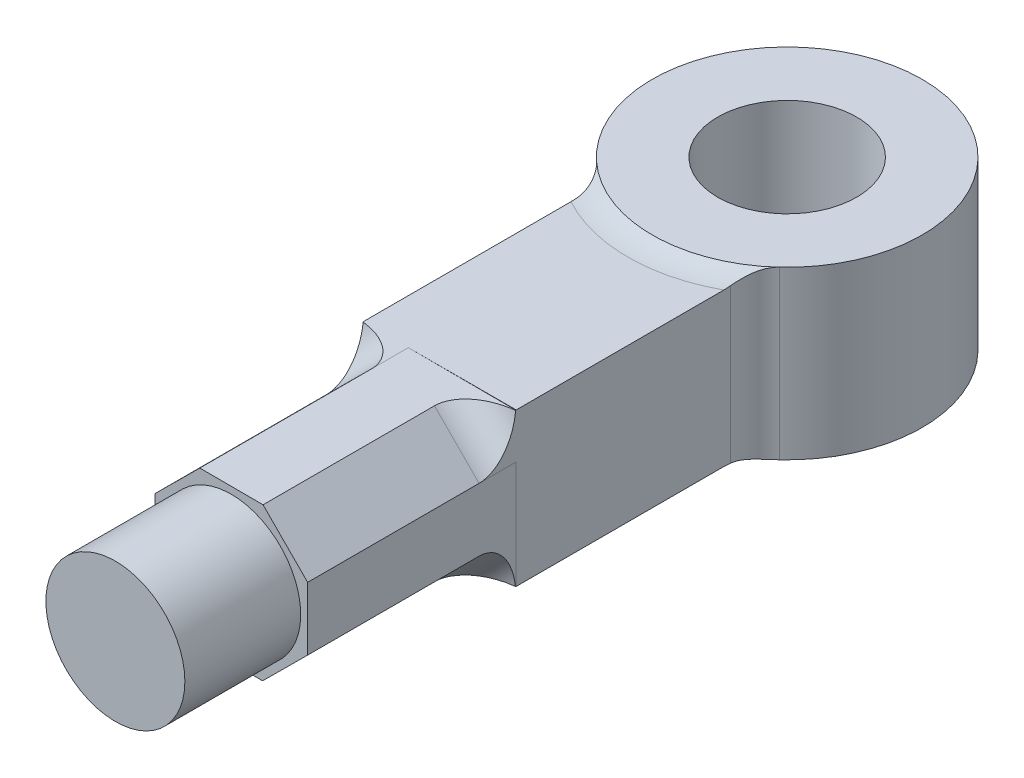
ISO-10303-21;
HEADER;
FILE_DESCRIPTION(('STEP AP214'),'2;1');
FILE_NAME('part.step','',(''),(''),'','','');
FILE_SCHEMA(('AUTOMOTIVE_DESIGN { 1 0 10303 214 1 1 1 1 }'));
ENDSEC;
DATA;
#1=APPLICATION_CONTEXT('core data for automotive mechanical design processes');
#2=APPLICATION_PROTOCOL_DEFINITION('international standard','automotive_design',2000,#1);
#3=PRODUCT_CONTEXT('',#1,'mechanical');
#4=PRODUCT('Part','Part','',(#3));
#5=PRODUCT_RELATED_PRODUCT_CATEGORY('part','',(#4));
#6=PRODUCT_DEFINITION_FORMATION('','',#4);
#7=PRODUCT_DEFINITION_CONTEXT('part definition',#1,'design');
#8=PRODUCT_DEFINITION('design','',#6,#7);
#9=PRODUCT_DEFINITION_SHAPE('','',#8);
#10=(LENGTH_UNIT() NAMED_UNIT(*) SI_UNIT(.MILLI.,.METRE.));
#11=(NAMED_UNIT(*) PLANE_ANGLE_UNIT() SI_UNIT($,.RADIAN.));
#12=(NAMED_UNIT(*) SI_UNIT($,.STERADIAN.) SOLID_ANGLE_UNIT());
#13=UNCERTAINTY_MEASURE_WITH_UNIT(LENGTH_MEASURE(1.E-05),#10,'distance_accuracy_value','');
#14=(GEOMETRIC_REPRESENTATION_CONTEXT(3) GLOBAL_UNCERTAINTY_ASSIGNED_CONTEXT((#13)) GLOBAL_UNIT_ASSIGNED_CONTEXT((#10,
#11,#12)) REPRESENTATION_CONTEXT('',''));
#15=CARTESIAN_POINT('',(0.,0.,0.));
#16=DIRECTION('',(0.,0.,1.));
#17=DIRECTION('',(1.,0.,0.));
#18=AXIS2_PLACEMENT_3D('',#15,#16,#17);
#19=CARTESIAN_POINT('',(0.,0.,75.));
#20=DIRECTION('',(0.,0.,1.));
#21=DIRECTION('',(1.,0.,0.));
#22=AXIS2_PLACEMENT_3D('',#19,#20,#21);
#23=PLANE('',#22);
#24=DIRECTION('',(0.999995344391328,-0.00305142518647974,0.));
#25=VECTOR('',#24,1.);
#26=CARTESIAN_POINT('',(-6.87618139629296,-16.4583423828631,75.));
#27=LINE('',#26,#25);
#28=CARTESIAN_POINT('',(-16.5,-16.4289758836667,75.));
#29=VERTEX_POINT('',#28);
#30=CARTESIAN_POINT('',(6.77561101202491,-16.5,75.));
#31=VERTEX_POINT('',#30);
#32=EDGE_CURVE('E575',#29,#31,#27,.T.);
#33=ORIENTED_EDGE('',*,*,#32,.F.);
#34=DIRECTION('',(0.,-1.,0.));
#35=VECTOR('',#34,1.);
#36=CARTESIAN_POINT('',(-16.5,16.5,75.));
#37=LINE('',#36,#35);
#38=CARTESIAN_POINT('',(-16.5,-16.5,75.));
#39=VERTEX_POINT('',#38);
#40=EDGE_CURVE('E249',#29,#39,#37,.T.);
#41=ORIENTED_EDGE('',*,*,#40,.T.);
#42=DIRECTION('',(1.,0.,0.));
#43=VECTOR('',#42,1.);
#44=CARTESIAN_POINT('',(-16.5,-16.5,75.));
#45=LINE('',#44,#43);
#46=EDGE_CURVE('E255',#39,#31,#45,.T.);
#47=ORIENTED_EDGE('',*,*,#46,.T.);
#48=EDGE_LOOP('',(#33,#41,#47));
#49=FACE_BOUND('',#48,.T.);
#50=ADVANCED_FACE('F43',(#49),#23,.T.);
#51=DIRECTION('',(-0.00305142518647999,-0.999995344391328,0.));
#52=VECTOR('',#51,1.);
#53=CARTESIAN_POINT('',(-16.4583423828631,6.87618139629296,75.));
#54=LINE('',#53,#52);
#55=CARTESIAN_POINT('',(-16.4289758836667,16.5,75.));
#56=VERTEX_POINT('',#55);
#57=CARTESIAN_POINT('',(-16.4999999999998,-6.77561101190644,75.));
#58=VERTEX_POINT('',#57);
#59=EDGE_CURVE('E220',#56,#58,#54,.T.);
#60=ORIENTED_EDGE('',*,*,#59,.F.);
#61=DIRECTION('',(-1.,0.,0.));
#62=VECTOR('',#61,1.);
#63=CARTESIAN_POINT('',(-16.5,16.5,75.));
#64=LINE('',#63,#62);
#65=CARTESIAN_POINT('',(-16.5,16.5,75.));
#66=VERTEX_POINT('',#65);
#67=EDGE_CURVE('E243',#56,#66,#64,.T.);
#68=ORIENTED_EDGE('',*,*,#67,.T.);
#69=EDGE_CURVE('E250',#66,#58,#37,.T.);
#70=ORIENTED_EDGE('',*,*,#69,.T.);
#71=EDGE_LOOP('',(#60,#68,#70));
#72=FACE_BOUND('',#71,.T.);
#73=ADVANCED_FACE('F505',(#72),#23,.T.);
#74=DIRECTION('',(-0.999995344391328,0.00305142518647567,0.));
#75=VECTOR('',#74,1.);
#76=CARTESIAN_POINT('',(6.87618139629296,16.4583423828631,75.));
#77=LINE('',#76,#75);
#78=CARTESIAN_POINT('',(16.5,16.4289758836667,75.));
#79=VERTEX_POINT('',#78);
#80=CARTESIAN_POINT('',(-6.77561101178325,16.4999999999996,75.));
#81=VERTEX_POINT('',#80);
#82=EDGE_CURVE('E474',#79,#81,#77,.T.);
#83=ORIENTED_EDGE('',*,*,#82,.F.);
#84=DIRECTION('',(0.,1.,0.));
#85=VECTOR('',#84,1.);
#86=CARTESIAN_POINT('',(16.5,16.5,75.));
#87=LINE('',#86,#85);
#88=CARTESIAN_POINT('',(16.5,16.5,75.));
#89=VERTEX_POINT('',#88);
#90=EDGE_CURVE('E244',#79,#89,#87,.T.);
#91=ORIENTED_EDGE('',*,*,#90,.T.);
#92=EDGE_CURVE('E245',#89,#81,#64,.T.);
#93=ORIENTED_EDGE('',*,*,#92,.T.);
#94=EDGE_LOOP('',(#83,#91,#93));
#95=FACE_BOUND('',#94,.T.);
#96=ADVANCED_FACE('F512',(#95),#23,.T.);
#97=CARTESIAN_POINT('',(0.,35.539952644041,0.));
#98=DIRECTION('',(0.,1.,0.));
#99=DIRECTION('',(0.,0.,1.));
#100=AXIS2_PLACEMENT_3D('',#97,#98,#99);
#101=CYLINDRICAL_SURFACE('',#100,15.);
#102=CARTESIAN_POINT('',(0.,18.,0.));
#103=DIRECTION('',(0.,1.,0.));
#104=DIRECTION('',(0.,0.,1.));
#105=AXIS2_PLACEMENT_3D('',#102,#103,#104);
#106=CIRCLE('',#105,15.);
#107=CARTESIAN_POINT('',(0.,18.,15.));
#108=VERTEX_POINT('',#107);
#109=EDGE_CURVE('E285',#108,#108,#106,.T.);
#110=ORIENTED_EDGE('',*,*,#109,.T.);
#111=EDGE_LOOP('',(#110));
#112=FACE_BOUND('',#111,.T.);
#113=CARTESIAN_POINT('',(0.,-18.,0.));
#114=DIRECTION('',(0.,1.,0.));
#115=DIRECTION('',(0.,0.,1.));
#116=AXIS2_PLACEMENT_3D('',#113,#114,#115);
#117=CIRCLE('',#116,15.);
#118=CARTESIAN_POINT('',(0.,-18.,15.));
#119=VERTEX_POINT('',#118);
#120=EDGE_CURVE('E289',#119,#119,#117,.T.);
#121=ORIENTED_EDGE('',*,*,#120,.F.);
#122=EDGE_LOOP('',(#121));
#123=FACE_BOUND('',#122,.T.);
#124=ADVANCED_FACE('F526',(#112,#123),#101,.F.);
#125=CARTESIAN_POINT('',(0.,35.539952644041,0.));
#126=DIRECTION('',(0.,1.,0.));
#127=DIRECTION('',(0.,0.,1.));
#128=AXIS2_PLACEMENT_3D('',#125,#126,#127);
#129=CYLINDRICAL_SURFACE('',#128,29.1216151340223);
#130=CARTESIAN_POINT('',(0.,18.,0.));
#131=DIRECTION('',(0.,1.,0.));
#132=DIRECTION('',(0.,0.,1.));
#133=AXIS2_PLACEMENT_3D('',#130,#131,#132);
#134=CIRCLE('',#133,29.1216151340223);
#135=CARTESIAN_POINT('',(19.7262510355933,18.,21.4229663701101));
#136=VERTEX_POINT('',#135);
#137=CARTESIAN_POINT('',(-19.7262510355933,18.,21.4229663701101));
#138=VERTEX_POINT('',#137);
#139=EDGE_CURVE('E281',#136,#138,#134,.T.);
#140=ORIENTED_EDGE('',*,*,#139,.F.);
#141=DIRECTION('',(0.,1.,0.));
#142=VECTOR('',#141,1.);
#143=CARTESIAN_POINT('',(19.7262510355933,35.539952644041,21.4229663701101));
#144=LINE('',#143,#142);
#145=CARTESIAN_POINT('',(19.7262510355933,-18.,21.4229663701101));
#146=VERTEX_POINT('',#145);
#147=EDGE_CURVE('E551',#136,#146,#144,.F.);
#148=ORIENTED_EDGE('',*,*,#147,.T.);
#149=CARTESIAN_POINT('',(0.,-18.,0.));
#150=DIRECTION('',(0.,1.,0.));
#151=DIRECTION('',(0.,0.,1.));
#152=AXIS2_PLACEMENT_3D('',#149,#150,#151);
#153=CIRCLE('',#152,29.1216151340223);
#154=CARTESIAN_POINT('',(-19.7262510355933,-18.,21.4229663701101));
#155=VERTEX_POINT('',#154);
#156=EDGE_CURVE('E276',#146,#155,#153,.T.);
#157=ORIENTED_EDGE('',*,*,#156,.T.);
#158=DIRECTION('',(0.,1.,0.));
#159=VECTOR('',#158,1.);
#160=CARTESIAN_POINT('',(-19.7262510355933,35.539952644041,21.4229663701101));
#161=LINE('',#160,#159);
#162=EDGE_CURVE('E548',#155,#138,#161,.T.);
#163=ORIENTED_EDGE('',*,*,#162,.T.);
#164=EDGE_LOOP('',(#140,#148,#157,#163));
#165=FACE_BOUND('',#164,.T.);
#166=ADVANCED_FACE('F531',(#165),#129,.T.);
#167=CARTESIAN_POINT('',(15.,-18.,0.));
#168=DIRECTION('',(0.,1.,0.));
#169=DIRECTION('',(0.,0.,1.));
#170=AXIS2_PLACEMENT_3D('',#167,#168,#169);
#171=PLANE('',#170);
#172=ORIENTED_EDGE('',*,*,#156,.F.);
#173=EDGE_CURVE('E275',#155,#146,#153,.T.);
#174=ORIENTED_EDGE('',*,*,#173,.F.);
#175=EDGE_LOOP('',(#172,#174));
#176=FACE_BOUND('',#175,.T.);
#177=ORIENTED_EDGE('',*,*,#120,.T.);
#178=EDGE_LOOP('',(#177));
#179=FACE_BOUND('',#178,.T.);
#180=ADVANCED_FACE('F326',(#176,#179),#171,.F.);
#181=CARTESIAN_POINT('',(15.,18.,0.));
#182=DIRECTION('',(0.,-1.,0.));
#183=DIRECTION('',(0.,0.,-1.));
#184=AXIS2_PLACEMENT_3D('',#181,#182,#183);
#185=PLANE('',#184);
#186=ORIENTED_EDGE('',*,*,#109,.F.);
#187=EDGE_LOOP('',(#186));
#188=FACE_BOUND('',#187,.T.);
#189=EDGE_CURVE('E280',#138,#136,#134,.T.);
#190=ORIENTED_EDGE('',*,*,#189,.T.);
#191=ORIENTED_EDGE('',*,*,#139,.T.);
#192=EDGE_LOOP('',(#190,#191));
#193=FACE_BOUND('',#192,.T.);
#194=ADVANCED_FACE('F516',(#188,#193),#185,.F.);
#195=DIRECTION('',(0.00305142518647948,0.999995344391328,0.));
#196=VECTOR('',#195,1.);
#197=CARTESIAN_POINT('',(16.4583423828631,-6.87618139629296,75.));
#198=LINE('',#197,#196);
#199=CARTESIAN_POINT('',(16.4289758836667,-16.5,75.));
#200=VERTEX_POINT('',#199);
#201=CARTESIAN_POINT('',(16.4999999999997,6.77561101180887,75.));
#202=VERTEX_POINT('',#201);
#203=EDGE_CURVE('E430',#200,#202,#198,.T.);
#204=ORIENTED_EDGE('',*,*,#203,.F.);
#205=CARTESIAN_POINT('',(16.5,-16.5,75.));
#206=VERTEX_POINT('',#205);
#207=EDGE_CURVE('E254',#200,#206,#45,.T.);
#208=ORIENTED_EDGE('',*,*,#207,.T.);
#209=EDGE_CURVE('E239',#206,#202,#87,.T.);
#210=ORIENTED_EDGE('',*,*,#209,.T.);
#211=EDGE_LOOP('',(#204,#208,#210));
#212=FACE_BOUND('',#211,.T.);
#213=ADVANCED_FACE('F508',(#212),#23,.T.);
#214=CARTESIAN_POINT('',(-16.5,-16.5,75.));
#215=DIRECTION('',(0.,1.,0.));
#216=DIRECTION('',(0.,0.,1.));
#217=AXIS2_PLACEMENT_3D('',#214,#215,#216);
#218=PLANE('',#217);
#219=DIRECTION('',(0.,0.,-1.));
#220=VECTOR('',#219,1.);
#221=CARTESIAN_POINT('',(-16.5,-16.5,75.));
#222=LINE('',#221,#220);
#223=CARTESIAN_POINT('',(-16.5,-16.5,30.1725657144037));
#224=VERTEX_POINT('',#223);
#225=EDGE_CURVE('E263',#39,#224,#222,.T.);
#226=ORIENTED_EDGE('',*,*,#225,.T.);
#227=CARTESIAN_POINT('',(0.,-16.5,0.));
#228=DIRECTION('',(0.,1.,0.));
#229=DIRECTION('',(0.,0.,1.));
#230=AXIS2_PLACEMENT_3D('',#227,#228,#229);
#231=CIRCLE('',#230,34.3894420104487);
#232=CARTESIAN_POINT('',(16.5,-16.5,30.1725657144037));
#233=VERTEX_POINT('',#232);
#234=EDGE_CURVE('E545',#224,#233,#231,.T.);
#235=ORIENTED_EDGE('',*,*,#234,.T.);
#236=DIRECTION('',(0.,0.,-1.));
#237=VECTOR('',#236,1.);
#238=CARTESIAN_POINT('',(16.5,-16.5,75.));
#239=LINE('',#238,#237);
#240=EDGE_CURVE('E259',#206,#233,#239,.T.);
#241=ORIENTED_EDGE('',*,*,#240,.F.);
#242=ORIENTED_EDGE('',*,*,#207,.F.);
#243=DIRECTION('',(0.,0.,1.));
#244=VECTOR('',#243,1.);
#245=CARTESIAN_POINT('',(16.4289758836667,-16.5,75.));
#246=LINE('',#245,#244);
#247=CARTESIAN_POINT('',(16.4289758836667,-16.5,75.0897400936926));
#248=VERTEX_POINT('',#247);
#249=EDGE_CURVE('E459',#200,#248,#246,.T.);
#250=ORIENTED_EDGE('',*,*,#249,.T.);
#251=CARTESIAN_POINT('',(18.124001108038,-16.5,83.));
#252=DIRECTION('',(0.,1.,0.));
#253=DIRECTION('',(1.,0.,0.));
#254=AXIS2_PLACEMENT_3D('',#251,#252,#253);
#255=ELLIPSE('',#254,11.3483900960131,8.);
#256=CARTESIAN_POINT('',(6.77561101202492,-16.5,83.));
#257=VERTEX_POINT('',#256);
#258=EDGE_CURVE('E437',#248,#257,#255,.T.);
#259=ORIENTED_EDGE('',*,*,#258,.T.);
#260=DIRECTION('',(0.,0.,1.));
#261=VECTOR('',#260,1.);
#262=CARTESIAN_POINT('',(6.77561101202492,-16.5,120.));
#263=LINE('',#262,#261);
#264=EDGE_CURVE('E225',#31,#257,#263,.T.);
#265=ORIENTED_EDGE('',*,*,#264,.F.);
#266=ORIENTED_EDGE('',*,*,#46,.F.);
#267=EDGE_LOOP('',(#226,#235,#241,#242,#250,#259,#265,#266));
#268=FACE_BOUND('',#267,.T.);
#269=ADVANCED_FACE('F495',(#268),#218,.F.);
#270=CARTESIAN_POINT('',(-16.5,16.5,75.));
#271=DIRECTION('',(0.,-1.,0.));
#272=DIRECTION('',(0.,0.,-1.));
#273=AXIS2_PLACEMENT_3D('',#270,#271,#272);
#274=PLANE('',#273);
#275=DIRECTION('',(0.,0.,-1.));
#276=VECTOR('',#275,1.);
#277=CARTESIAN_POINT('',(16.5,16.5,75.));
#278=LINE('',#277,#276);
#279=CARTESIAN_POINT('',(16.5,16.5,30.1725657144037));
#280=VERTEX_POINT('',#279);
#281=EDGE_CURVE('E271',#89,#280,#278,.T.);
#282=ORIENTED_EDGE('',*,*,#281,.T.);
#283=CARTESIAN_POINT('',(0.,16.5,0.));
#284=DIRECTION('',(0.,-1.,0.));
#285=DIRECTION('',(0.,0.,-1.));
#286=AXIS2_PLACEMENT_3D('',#283,#284,#285);
#287=CIRCLE('',#286,34.3894420104486);
#288=CARTESIAN_POINT('',(-16.5,16.5,30.1725657144037));
#289=VERTEX_POINT('',#288);
#290=EDGE_CURVE('E293',#280,#289,#287,.T.);
#291=ORIENTED_EDGE('',*,*,#290,.T.);
#292=DIRECTION('',(0.,0.,-1.));
#293=VECTOR('',#292,1.);
#294=CARTESIAN_POINT('',(-16.5,16.5,75.));
#295=LINE('',#294,#293);
#296=EDGE_CURVE('E267',#66,#289,#295,.T.);
#297=ORIENTED_EDGE('',*,*,#296,.F.);
#298=ORIENTED_EDGE('',*,*,#67,.F.);
#299=DIRECTION('',(0.,0.,1.));
#300=VECTOR('',#299,1.);
#301=CARTESIAN_POINT('',(-16.4289758836667,16.5,75.));
#302=LINE('',#301,#300);
#303=CARTESIAN_POINT('',(-16.4289758836667,16.5,75.0897400936926));
#304=VERTEX_POINT('',#303);
#305=EDGE_CURVE('E432',#56,#304,#302,.T.);
#306=ORIENTED_EDGE('',*,*,#305,.T.);
#307=CARTESIAN_POINT('',(-18.124001108038,16.5,83.));
#308=DIRECTION('',(0.,-1.,0.));
#309=DIRECTION('',(-1.,0.,0.));
#310=AXIS2_PLACEMENT_3D('',#307,#308,#309);
#311=ELLIPSE('',#310,11.3483900960131,8.);
#312=CARTESIAN_POINT('',(-6.77561101203458,16.5,82.9999925951792));
#313=VERTEX_POINT('',#312);
#314=EDGE_CURVE('E446',#304,#313,#311,.T.);
#315=ORIENTED_EDGE('',*,*,#314,.T.);
#316=DIRECTION('',(0.,0.,1.));
#317=VECTOR('',#316,1.);
#318=CARTESIAN_POINT('',(-6.77561101204424,16.5,120.));
#319=LINE('',#318,#317);
#320=EDGE_CURVE('E53',#81,#313,#319,.T.);
#321=ORIENTED_EDGE('',*,*,#320,.F.);
#322=ORIENTED_EDGE('',*,*,#92,.F.);
#323=EDGE_LOOP('',(#282,#291,#297,#298,#306,#315,#321,#322));
#324=FACE_BOUND('',#323,.T.);
#325=ADVANCED_FACE('F522',(#324),#274,.F.);
#326=CARTESIAN_POINT('',(-16.5,16.5,75.));
#327=DIRECTION('',(1.,0.,0.));
#328=DIRECTION('',(0.,1.,0.));
#329=AXIS2_PLACEMENT_3D('',#326,#327,#328);
#330=PLANE('',#329);
#331=CARTESIAN_POINT('',(-16.5,16.5,30.1725657144037));
#332=CARTESIAN_POINT('',(-16.5,16.4999826263791,29.7410259284523));
#333=CARTESIAN_POINT('',(-16.5,16.5215004059836,29.3095895094575));
#334=CARTESIAN_POINT('',(-16.5,16.6061863159555,28.4506569435438));
#335=CARTESIAN_POINT('',(-16.5,16.6693687648358,28.0231622024551));
#336=CARTESIAN_POINT('',(-16.5,16.8341914286109,27.1851512942685));
#337=CARTESIAN_POINT('',(-16.5,16.934985579774,26.7744673819231));
#338=CARTESIAN_POINT('',(-16.5,17.173727041169,25.9642993223079));
#339=CARTESIAN_POINT('',(-16.5,17.3116477148838,25.5648073713306));
#340=CARTESIAN_POINT('',(-16.5,17.5467776793455,24.9730221151067));
#341=CARTESIAN_POINT('',(-16.5,17.6307002566657,24.7753549087669));
#342=CARTESIAN_POINT('',(-16.5,17.8081919854659,24.3830844860247));
#343=CARTESIAN_POINT('',(-16.5,17.9018118446751,24.1885042153486));
#344=CARTESIAN_POINT('',(-16.5,18.,23.9962177856035));
#345=B_SPLINE_CURVE_WITH_KNOTS('',3,(#331,#332,#333,#334,#335,#336,#337,#338,#339,#340,#341,
#342,#343,#344),.UNSPECIFIED.,.F.,.F.,(4,2,2,2,2,2,4),(0.,1.29394428637386,2.58833348256147,
3.85520730098164,5.12117460897788,5.7652053200681,6.4127922472087),.UNSPECIFIED.);
#346=CARTESIAN_POINT('',(-16.5,16.5741647271571,28.7793462520357));
#347=VERTEX_POINT('',#346);
#348=EDGE_CURVE('E297',#289,#347,#345,.T.);
#349=ORIENTED_EDGE('',*,*,#348,.T.);
#350=DIRECTION('',(0.,-1.,0.));
#351=VECTOR('',#350,1.);
#352=CARTESIAN_POINT('',(-16.5,-16.5,28.7793462520357));
#353=LINE('',#352,#351);
#354=CARTESIAN_POINT('',(-16.5,-16.5741647271571,28.7793462520357));
#355=VERTEX_POINT('',#354);
#356=EDGE_CURVE('E557',#347,#355,#353,.T.);
#357=ORIENTED_EDGE('',*,*,#356,.T.);
#358=CARTESIAN_POINT('',(-16.5,-16.5741647271571,28.7793462520357));
#359=CARTESIAN_POINT('',(-16.5,-16.5618706565201,28.8950549775934));
#360=CARTESIAN_POINT('',(-16.5,-16.5510869500951,29.0109247354759));
#361=CARTESIAN_POINT('',(-16.5,-16.5325739567857,29.2428263333676));
#362=CARTESIAN_POINT('',(-16.5,-16.5248425384399,29.358858003287));
#363=CARTESIAN_POINT('',(-16.5,-16.512450471289,29.5910867842669));
#364=CARTESIAN_POINT('',(-16.5,-16.5077898550496,29.7072838970687));
#365=CARTESIAN_POINT('',(-16.5,-16.5015634594469,29.9398423120486));
#366=CARTESIAN_POINT('',(-16.5,-16.4999998489196,30.0562036722227));
#367=CARTESIAN_POINT('',(-16.5,-16.5,30.1725657144037));
#368=B_SPLINE_CURVE_WITH_KNOTS('',3,(#358,#359,#360,#361,#362,#363,#364,#365,#366,#367),
.UNSPECIFIED.,.F.,.F.,(4,2,2,2,4),(0.,0.349070935310408,0.697897675807058,1.04672811552504,
1.39580275525958),.UNSPECIFIED.);
#369=EDGE_CURVE('E345',#355,#224,#368,.T.);
#370=ORIENTED_EDGE('',*,*,#369,.T.);
#371=ORIENTED_EDGE('',*,*,#225,.F.);
#372=ORIENTED_EDGE('',*,*,#40,.F.);
#373=DIRECTION('',(0.,0.,1.));
#374=VECTOR('',#373,1.);
#375=CARTESIAN_POINT('',(-16.5,-16.4289758836667,75.));
#376=LINE('',#375,#374);
#377=CARTESIAN_POINT('',(-16.5,-16.4289758836667,75.0897400936926));
#378=VERTEX_POINT('',#377);
#379=EDGE_CURVE('E449',#29,#378,#376,.T.);
#380=ORIENTED_EDGE('',*,*,#379,.T.);
#381=CARTESIAN_POINT('',(-16.5,-18.124001108038,83.));
#382=DIRECTION('',(1.,0.,0.));
#383=DIRECTION('',(0.,-1.,0.));
#384=AXIS2_PLACEMENT_3D('',#381,#382,#383);
#385=ELLIPSE('',#384,11.3483900960131,8.);
#386=CARTESIAN_POINT('',(-16.5,-6.77561101202491,83.));
#387=VERTEX_POINT('',#386);
#388=EDGE_CURVE('E483',#378,#387,#385,.T.);
#389=ORIENTED_EDGE('',*,*,#388,.T.);
#390=DIRECTION('',(0.,0.,1.));
#391=VECTOR('',#390,1.);
#392=CARTESIAN_POINT('',(-16.5,-6.77561101202331,120.));
#393=LINE('',#392,#391);
#394=EDGE_CURVE('E455',#58,#387,#393,.T.);
#395=ORIENTED_EDGE('',*,*,#394,.F.);
#396=ORIENTED_EDGE('',*,*,#69,.F.);
#397=ORIENTED_EDGE('',*,*,#296,.T.);
#398=EDGE_LOOP('',(#349,#357,#370,#371,#372,#380,#389,#395,#396,#397));
#399=FACE_BOUND('',#398,.T.);
#400=ADVANCED_FACE('F314',(#399),#330,.F.);
#401=CARTESIAN_POINT('',(16.5,16.5,75.));
#402=DIRECTION('',(-1.,0.,0.));
#403=DIRECTION('',(0.,-1.,0.));
#404=AXIS2_PLACEMENT_3D('',#401,#402,#403);
#405=PLANE('',#404);
#406=CARTESIAN_POINT('',(16.5,-16.5,30.1725657144037));
#407=CARTESIAN_POINT('',(16.5,-16.4999998489196,30.0562036722227));
#408=CARTESIAN_POINT('',(16.5,-16.5015634594469,29.9398423120486));
#409=CARTESIAN_POINT('',(16.5,-16.5077898550496,29.7072838970687));
#410=CARTESIAN_POINT('',(16.5,-16.512450471289,29.5910867842669));
#411=CARTESIAN_POINT('',(16.5,-16.5248425384399,29.358858003287));
#412=CARTESIAN_POINT('',(16.5,-16.5325739567857,29.2428263333676));
#413=CARTESIAN_POINT('',(16.5,-16.5510869500951,29.0109247354759));
#414=CARTESIAN_POINT('',(16.5,-16.5618706565201,28.8950549775934));
#415=CARTESIAN_POINT('',(16.5,-16.5741647271571,28.7793462520357));
#416=B_SPLINE_CURVE_WITH_KNOTS('',3,(#406,#407,#408,#409,#410,#411,#412,#413,#414,#415),
.UNSPECIFIED.,.F.,.F.,(4,2,2,2,4),(0.,0.349074639734524,0.697905079452511,1.04673181994916,
1.39580275525956),.UNSPECIFIED.);
#417=CARTESIAN_POINT('',(16.5,-16.5741647271571,28.7793462520357));
#418=VERTEX_POINT('',#417);
#419=EDGE_CURVE('E560',#233,#418,#416,.T.);
#420=ORIENTED_EDGE('',*,*,#419,.T.);
#421=DIRECTION('',(0.,-1.,0.));
#422=VECTOR('',#421,1.);
#423=CARTESIAN_POINT('',(16.5,18.,28.7793462520357));
#424=LINE('',#423,#422);
#425=CARTESIAN_POINT('',(16.5,16.5741647271549,28.7793462520563));
#426=VERTEX_POINT('',#425);
#427=EDGE_CURVE('E554',#418,#426,#424,.F.);
#428=ORIENTED_EDGE('',*,*,#427,.T.);
#429=CARTESIAN_POINT('',(16.5,18.,23.9962177856036));
#430=CARTESIAN_POINT('',(16.5,17.804042432493,24.3800248534783));
#431=CARTESIAN_POINT('',(16.5,17.6261976982969,24.7730713581624));
#432=CARTESIAN_POINT('',(16.5,17.3078433567267,25.5744456273851));
#433=CARTESIAN_POINT('',(16.5,17.1673698761392,25.9827877464126));
#434=CARTESIAN_POINT('',(16.5,16.9278909540535,26.8017704478447));
#435=CARTESIAN_POINT('',(16.5,16.82804770094,27.2121665406336));
#436=CARTESIAN_POINT('',(16.5,16.6669096324146,28.0401616842526));
#437=CARTESIAN_POINT('',(16.5,16.6055795855285,28.457753791816));
#438=CARTESIAN_POINT('',(16.5,16.5429255982997,29.0918051959721));
#439=CARTESIAN_POINT('',(16.5,16.5269240173645,29.3068998934332));
#440=CARTESIAN_POINT('',(16.5,16.5054320817772,29.7388362210268));
#441=CARTESIAN_POINT('',(16.5,16.5000018827512,29.9556808384521));
#442=CARTESIAN_POINT('',(16.5,16.5,30.1725657144037));
#443=B_SPLINE_CURVE_WITH_KNOTS('',3,(#429,#430,#431,#432,#433,#434,#435,#436,#437,#438,#439,
#440,#441,#442),.UNSPECIFIED.,.F.,.F.,(4,2,2,2,2,2,4),(0.,1.29233639163793,2.58591758214176,
3.85127794969538,5.11547908622128,5.7623195111448,6.41283009466045),.UNSPECIFIED.);
#444=EDGE_CURVE('E307',#426,#280,#443,.T.);
#445=ORIENTED_EDGE('',*,*,#444,.T.);
#446=ORIENTED_EDGE('',*,*,#281,.F.);
#447=ORIENTED_EDGE('',*,*,#90,.F.);
#448=DIRECTION('',(0.,0.,1.));
#449=VECTOR('',#448,1.);
#450=CARTESIAN_POINT('',(16.5,16.4289758836667,75.));
#451=LINE('',#450,#449);
#452=CARTESIAN_POINT('',(16.5,16.4289758836667,75.0897400936926));
#453=VERTEX_POINT('',#452);
#454=EDGE_CURVE('E422',#79,#453,#451,.T.);
#455=ORIENTED_EDGE('',*,*,#454,.T.);
#456=CARTESIAN_POINT('',(16.5,18.124001108038,83.));
#457=DIRECTION('',(-1.,0.,0.));
#458=DIRECTION('',(0.,1.,0.));
#459=AXIS2_PLACEMENT_3D('',#456,#457,#458);
#460=ELLIPSE('',#459,11.3483900960131,8.);
#461=CARTESIAN_POINT('',(16.5,6.77561101202493,83.));
#462=VERTEX_POINT('',#461);
#463=EDGE_CURVE('E416',#453,#462,#460,.T.);
#464=ORIENTED_EDGE('',*,*,#463,.T.);
#465=DIRECTION('',(0.,0.,1.));
#466=VECTOR('',#465,1.);
#467=CARTESIAN_POINT('',(16.5,6.7756110120256,120.));
#468=LINE('',#467,#466);
#469=EDGE_CURVE('E419',#202,#462,#468,.T.);
#470=ORIENTED_EDGE('',*,*,#469,.F.);
#471=ORIENTED_EDGE('',*,*,#209,.F.);
#472=ORIENTED_EDGE('',*,*,#240,.T.);
#473=EDGE_LOOP('',(#420,#428,#445,#446,#447,#455,#464,#470,#471,#472));
#474=FACE_BOUND('',#473,.T.);
#475=ADVANCED_FACE('F324',(#474),#405,.F.);
#476=CARTESIAN_POINT('',(0.,26.5,0.));
#477=DIRECTION('',(0.,-1.,0.));
#478=DIRECTION('',(0.,0.,-1.));
#479=AXIS2_PLACEMENT_3D('',#476,#477,#478);
#480=TOROIDAL_SURFACE('',#479,34.3894420104486,10.);
#481=ORIENTED_EDGE('',*,*,#444,.F.);
#482=CARTESIAN_POINT('',(16.5,16.5741647271572,28.7793462520357));
#483=CARTESIAN_POINT('',(16.4999991463114,16.5890365597983,28.6393492121577));
#484=CARTESIAN_POINT('',(16.502940170049,16.6059445134704,28.4996007097701));
#485=CARTESIAN_POINT('',(16.5146329749657,16.6434067570666,28.2208692779692));
#486=CARTESIAN_POINT('',(16.5233833717416,16.6639601774025,28.0818861741119));
#487=CARTESIAN_POINT('',(16.558203670365,16.7303905166774,27.6668361709195));
#488=CARTESIAN_POINT('',(16.5928431758895,16.7810884191725,27.3922137317962));
#489=CARTESIAN_POINT('',(16.6844895677429,16.8919228449266,26.8473827251292));
#490=CARTESIAN_POINT('',(16.741601150537,16.9521027459718,26.5772010755633));
#491=CARTESIAN_POINT('',(16.8775637108067,17.0778405945778,26.0435536666951));
#492=CARTESIAN_POINT('',(16.9564226899638,17.1434005154007,25.7800904183993));
#493=CARTESIAN_POINT('',(17.1350933976702,17.2755280432518,25.2617595217434));
#494=CARTESIAN_POINT('',(17.2348290197091,17.3420911966867,25.0068644512937));
#495=CARTESIAN_POINT('',(17.4551918012785,17.4721782289682,24.5054212483028));
#496=CARTESIAN_POINT('',(17.5758200724879,17.5357019458594,24.2588735607534));
#497=CARTESIAN_POINT('',(17.8371847594414,17.6549459893199,23.7762900445388));
#498=CARTESIAN_POINT('',(17.9778209540843,17.7107026205062,23.5402090865518));
#499=CARTESIAN_POINT('',(18.2793391544417,17.81031346987,23.0787707835545));
#500=CARTESIAN_POINT('',(18.4402078185476,17.8541754719412,22.853406505532));
#501=CARTESIAN_POINT('',(18.6946153958707,17.9077735104774,22.5267783810219));
#502=CARTESIAN_POINT('',(18.7807873920245,17.9235202411065,22.4206910627958));
#503=CARTESIAN_POINT('',(18.957677335122,17.9508243169076,22.2118441963565));
#504=CARTESIAN_POINT('',(19.0483941740585,17.9623826775779,22.1090838470074));
#505=CARTESIAN_POINT('',(19.2345352012985,17.9810435303099,21.9067938671508));
#506=CARTESIAN_POINT('',(19.3299754677021,17.9881294867049,21.8072775011057));
#507=CARTESIAN_POINT('',(19.5250428686372,17.9976195665822,21.6121259910292));
#508=CARTESIAN_POINT('',(19.6246716524072,18.0000218278721,21.5164924055451));
#509=CARTESIAN_POINT('',(19.7262510355933,18.,21.4229663701101));
#510=B_SPLINE_CURVE_WITH_KNOTS('',3,(#482,#483,#484,#485,#486,#487,#488,#489,#490,#491,#492,
#493,#494,#495,#496,#497,#498,#499,#500,#501,#502,#503,#504,#505,#506,#507,#508,#509),
.UNSPECIFIED.,.F.,.F.,(4,2,2,2,2,2,2,2,2,2,2,2,2,4),(0.,0.422252242564298,0.844403896372584,
1.68733989060065,2.5342504941473,3.38147312452782,4.22565935198086,5.06989051163325,
5.91003273983222,6.74962384148388,7.1622137822887,7.57470362087732,7.98870974539596,
8.40288044124798),.UNSPECIFIED.);
#511=EDGE_CURVE('E336',#426,#136,#510,.T.);
#512=ORIENTED_EDGE('',*,*,#511,.T.);
#513=ORIENTED_EDGE('',*,*,#189,.F.);
#514=CARTESIAN_POINT('',(-19.7262510355933,18.,21.4229663701101));
#515=CARTESIAN_POINT('',(-19.6300523535681,18.0000176276562,21.5115394206693));
#516=CARTESIAN_POINT('',(-19.5356017933812,17.9978650082523,21.6020024925083));
#517=CARTESIAN_POINT('',(-19.3504273211846,17.9893495949321,21.7864456292561));
#518=CARTESIAN_POINT('',(-19.2597027851783,17.9829875090532,21.8804251001948));
#519=CARTESIAN_POINT('',(-19.0823446863004,17.9661991538311,22.0714886627016));
#520=CARTESIAN_POINT('',(-18.995703772279,17.9557805266849,22.1685666031439));
#521=CARTESIAN_POINT('',(-18.8265048572669,17.9311279290078,22.3657391930829));
#522=CARTESIAN_POINT('',(-18.7439469940994,17.9168938297897,22.4658339442287));
#523=CARTESIAN_POINT('',(-18.5036036069199,17.8691163072635,22.7690341961438));
#524=CARTESIAN_POINT('',(-18.3520082435613,17.8303824569603,22.9762864184954));
#525=CARTESIAN_POINT('',(-18.0661127196663,17.7420797002601,23.4002199093723));
#526=CARTESIAN_POINT('',(-17.9318204987747,17.6925058478067,23.6169054458478));
#527=CARTESIAN_POINT('',(-17.6816679090811,17.5863752429353,24.0569897631287));
#528=CARTESIAN_POINT('',(-17.565690011367,17.5298675306899,24.2803338012429));
#529=CARTESIAN_POINT('',(-17.3512100170885,17.4130681771518,24.7342674450371));
#530=CARTESIAN_POINT('',(-17.2527071608467,17.3527767005018,24.9648567352372));
#531=CARTESIAN_POINT('',(-17.0732685105978,17.2317270436936,25.4327733203106));
#532=CARTESIAN_POINT('',(-16.9923407365392,17.1709686635145,25.6701036356574));
#533=CARTESIAN_POINT('',(-16.8483857429099,17.0522181155133,26.150798512179));
#534=CARTESIAN_POINT('',(-16.7853555890269,16.9942254955438,26.3941620770815));
#535=CARTESIAN_POINT('',(-16.6933832161041,16.9001910716771,26.8141515428719));
#536=CARTESIAN_POINT('',(-16.6598635175349,16.8626929315087,26.9894602289203));
#537=CARTESIAN_POINT('',(-16.602169601255,16.7916521715382,27.3423663963901));
#538=CARTESIAN_POINT('',(-16.5779928374172,16.7581084758092,27.5199632405927));
#539=CARTESIAN_POINT('',(-16.5391715389733,16.6959801485197,27.8770522368677));
#540=CARTESIAN_POINT('',(-16.5245261151423,16.6673950545297,28.0565442105459));
#541=CARTESIAN_POINT('',(-16.504934057612,16.6161147147786,28.4170035716901));
#542=CARTESIAN_POINT('',(-16.4999935535874,16.5934231992757,28.5979718191777));
#543=CARTESIAN_POINT('',(-16.5,16.5741647271571,28.7793462520357));
#544=B_SPLINE_CURVE_WITH_KNOTS('',3,(#514,#515,#516,#517,#518,#519,#520,#521,#522,#523,#524,
#525,#526,#527,#528,#529,#530,#531,#532,#533,#534,#535,#536,#537,#538,#539,#540,#541,#542,#543),
.UNSPECIFIED.,.F.,.F.,(4,2,2,2,2,2,2,2,2,2,2,2,2,2,4),(0.,0.392241157815758,0.784416356970977,
1.17585627691634,1.56730940090108,2.34519166601491,3.12342960521237,3.89645036109459,
4.66943750387162,5.44277664222719,6.21598891844181,6.76286591339812,7.30959376871493,
7.85627060981536,8.40329262379577),.UNSPECIFIED.);
#545=EDGE_CURVE('E344',#138,#347,#544,.T.);
#546=ORIENTED_EDGE('',*,*,#545,.T.);
#547=ORIENTED_EDGE('',*,*,#348,.F.);
#548=ORIENTED_EDGE('',*,*,#290,.F.);
#549=EDGE_LOOP('',(#481,#512,#513,#546,#547,#548));
#550=FACE_BOUND('',#549,.T.);
#551=ADVANCED_FACE('F318',(#550),#480,.F.);
#552=CARTESIAN_POINT('',(-26.5,35.539952644041,28.7793462520357));
#553=DIRECTION('',(0.,1.,0.));
#554=DIRECTION('',(0.,0.,1.));
#555=AXIS2_PLACEMENT_3D('',#552,#553,#554);
#556=CYLINDRICAL_SURFACE('',#555,10.);
#557=ORIENTED_EDGE('',*,*,#545,.F.);
#558=ORIENTED_EDGE('',*,*,#162,.F.);
#559=CARTESIAN_POINT('',(-19.7262510355933,-18.,21.4229663701101));
#560=CARTESIAN_POINT('',(-19.6300523535681,-18.0000176276562,21.5115394206693));
#561=CARTESIAN_POINT('',(-19.5356017933812,-17.9978650082523,21.6020024925083));
#562=CARTESIAN_POINT('',(-19.3504273211846,-17.9893495949321,21.7864456292561));
#563=CARTESIAN_POINT('',(-19.2597027851783,-17.9829875090532,21.8804251001948));
#564=CARTESIAN_POINT('',(-19.0823446863004,-17.9661991538311,22.0714886627016));
#565=CARTESIAN_POINT('',(-18.995703772279,-17.955780526685,22.1685666031439));
#566=CARTESIAN_POINT('',(-18.8265048572669,-17.9311279290079,22.3657391930829));
#567=CARTESIAN_POINT('',(-18.7439469940994,-17.9168938297898,22.4658339442287));
#568=CARTESIAN_POINT('',(-18.5036036069199,-17.8691163072635,22.7690341961438));
#569=CARTESIAN_POINT('',(-18.3520082435613,-17.8303824569603,22.9762864184954));
#570=CARTESIAN_POINT('',(-18.0661127196663,-17.7420797002601,23.4002199093723));
#571=CARTESIAN_POINT('',(-17.9318204987747,-17.6925058478068,23.6169054458478));
#572=CARTESIAN_POINT('',(-17.6816679090811,-17.5863752429353,24.0569897631287));
#573=CARTESIAN_POINT('',(-17.565690011367,-17.5298675306899,24.2803338012429));
#574=CARTESIAN_POINT('',(-17.3512100170885,-17.4130681771519,24.7342674450371));
#575=CARTESIAN_POINT('',(-17.2527071608467,-17.3527767005018,24.9648567352372));
#576=CARTESIAN_POINT('',(-17.0732685105978,-17.2317270436936,25.4327733203106));
#577=CARTESIAN_POINT('',(-16.9923407365392,-17.1709686635146,25.6701036356573));
#578=CARTESIAN_POINT('',(-16.8483857429099,-17.0522181155133,26.150798512179));
#579=CARTESIAN_POINT('',(-16.7853555890269,-16.9942254955438,26.3941620770815));
#580=CARTESIAN_POINT('',(-16.6933832161041,-16.9001910716771,26.8141515428719));
#581=CARTESIAN_POINT('',(-16.6598635175349,-16.8626929315087,26.9894602289203));
#582=CARTESIAN_POINT('',(-16.602169601255,-16.7916521715382,27.3423663963901));
#583=CARTESIAN_POINT('',(-16.5779928374172,-16.7581084758092,27.5199632405927));
#584=CARTESIAN_POINT('',(-16.5391715389733,-16.6959801485197,27.8770522368677));
#585=CARTESIAN_POINT('',(-16.5245261151423,-16.6673950545297,28.0565442105459));
#586=CARTESIAN_POINT('',(-16.504934057612,-16.6161147147786,28.4170035716901));
#587=CARTESIAN_POINT('',(-16.4999935535874,-16.5934231992757,28.5979718191777));
#588=CARTESIAN_POINT('',(-16.5,-16.5741647271571,28.7793462520357));
#589=B_SPLINE_CURVE_WITH_KNOTS('',3,(#559,#560,#561,#562,#563,#564,#565,#566,#567,#568,#569,
#570,#571,#572,#573,#574,#575,#576,#577,#578,#579,#580,#581,#582,#583,#584,#585,#586,#587,#588),
.UNSPECIFIED.,.F.,.F.,(4,2,2,2,2,2,2,2,2,2,2,2,2,2,4),(0.,0.392241157815758,0.784416356970977,
1.17585627691634,1.56730940090108,2.34519166601491,3.12342960521237,3.89645036109458,
4.66943750387161,5.44277664222718,6.2159889184418,6.76286591339812,7.30959376871493,
7.85627060981536,8.40329262379578),.UNSPECIFIED.);
#590=EDGE_CURVE('E233',#355,#155,#589,.F.);
#591=ORIENTED_EDGE('',*,*,#590,.F.);
#592=ORIENTED_EDGE('',*,*,#356,.F.);
#593=EDGE_LOOP('',(#557,#558,#591,#592));
#594=FACE_BOUND('',#593,.T.);
#595=ADVANCED_FACE('F323',(#594),#556,.F.);
#596=CARTESIAN_POINT('',(26.5,35.5399526440411,28.7793462520357));
#597=DIRECTION('',(0.,1.,0.));
#598=DIRECTION('',(0.,0.,1.));
#599=AXIS2_PLACEMENT_3D('',#596,#597,#598);
#600=CYLINDRICAL_SURFACE('',#599,10.);
#601=ORIENTED_EDGE('',*,*,#427,.F.);
#602=CARTESIAN_POINT('',(16.5,-16.5741647271571,28.7793462520357));
#603=CARTESIAN_POINT('',(16.4999991463114,-16.5890365597983,28.6393492121578));
#604=CARTESIAN_POINT('',(16.502940170049,-16.6059445134704,28.4996007097702));
#605=CARTESIAN_POINT('',(16.5146329749657,-16.6434067570666,28.2208692779692));
#606=CARTESIAN_POINT('',(16.5233833717416,-16.6639601774025,28.0818861741119));
#607=CARTESIAN_POINT('',(16.558203670365,-16.7303905166774,27.6668361709195));
#608=CARTESIAN_POINT('',(16.5928431758895,-16.7810884191725,27.3922137317962));
#609=CARTESIAN_POINT('',(16.6844895677429,-16.8919228449267,26.8473827251292));
#610=CARTESIAN_POINT('',(16.7416011505369,-16.9521027459718,26.5772010755633));
#611=CARTESIAN_POINT('',(16.8775637108066,-17.0778405945778,26.0435536666951));
#612=CARTESIAN_POINT('',(16.9564226899638,-17.1434005154007,25.7800904183993));
#613=CARTESIAN_POINT('',(17.1350933976702,-17.2755280432518,25.2617595217435));
#614=CARTESIAN_POINT('',(17.2348290197091,-17.3420911966867,25.0068644512937));
#615=CARTESIAN_POINT('',(17.4551918012785,-17.4721782289682,24.5054212483029));
#616=CARTESIAN_POINT('',(17.5758200724879,-17.5357019458594,24.2588735607534));
#617=CARTESIAN_POINT('',(17.8371847594414,-17.6549459893199,23.7762900445388));
#618=CARTESIAN_POINT('',(17.9778209540843,-17.7107026205062,23.5402090865518));
#619=CARTESIAN_POINT('',(18.2793391544417,-17.81031346987,23.0787707835546));
#620=CARTESIAN_POINT('',(18.4402078185476,-17.8541754719412,22.853406505532));
#621=CARTESIAN_POINT('',(18.6946153958707,-17.9077735104774,22.5267783810219));
#622=CARTESIAN_POINT('',(18.7807873920245,-17.9235202411065,22.4206910627958));
#623=CARTESIAN_POINT('',(18.957677335122,-17.9508243169076,22.2118441963566));
#624=CARTESIAN_POINT('',(19.0483941740585,-17.9623826775779,22.1090838470075));
#625=CARTESIAN_POINT('',(19.2345352012985,-17.9810435303099,21.9067938671508));
#626=CARTESIAN_POINT('',(19.3299754677021,-17.988129486705,21.8072775011057));
#627=CARTESIAN_POINT('',(19.5250428686372,-17.9976195665822,21.6121259910292));
#628=CARTESIAN_POINT('',(19.6246716524072,-18.0000218278721,21.5164924055451));
#629=CARTESIAN_POINT('',(19.7262510355933,-18.,21.4229663701101));
#630=B_SPLINE_CURVE_WITH_KNOTS('',3,(#602,#603,#604,#605,#606,#607,#608,#609,#610,#611,#612,
#613,#614,#615,#616,#617,#618,#619,#620,#621,#622,#623,#624,#625,#626,#627,#628,#629),
.UNSPECIFIED.,.F.,.F.,(4,2,2,2,2,2,2,2,2,2,2,2,2,4),(0.,0.422252242564291,0.844403896372574,
1.68733989060064,2.53425049414728,3.3814731245278,4.22565935198083,5.06989051163322,
5.91003273983218,6.74962384148384,7.16221378228866,7.5747036208773,7.98870974539595,
8.40288044124799),.UNSPECIFIED.);
#631=EDGE_CURVE('E228',#146,#418,#630,.F.);
#632=ORIENTED_EDGE('',*,*,#631,.F.);
#633=ORIENTED_EDGE('',*,*,#147,.F.);
#634=ORIENTED_EDGE('',*,*,#511,.F.);
#635=EDGE_LOOP('',(#601,#632,#633,#634));
#636=FACE_BOUND('',#635,.T.);
#637=ADVANCED_FACE('F328',(#636),#600,.F.);
#638=CARTESIAN_POINT('',(0.,-26.5,0.));
#639=DIRECTION('',(0.,1.,0.));
#640=DIRECTION('',(0.,0.,1.));
#641=AXIS2_PLACEMENT_3D('',#638,#639,#640);
#642=TOROIDAL_SURFACE('',#641,34.3894420104487,10.);
#643=ORIENTED_EDGE('',*,*,#590,.T.);
#644=ORIENTED_EDGE('',*,*,#173,.T.);
#645=ORIENTED_EDGE('',*,*,#631,.T.);
#646=ORIENTED_EDGE('',*,*,#419,.F.);
#647=ORIENTED_EDGE('',*,*,#234,.F.);
#648=ORIENTED_EDGE('',*,*,#369,.F.);
#649=EDGE_LOOP('',(#643,#644,#645,#646,#647,#648));
#650=FACE_BOUND('',#649,.T.);
#651=ADVANCED_FACE('F367',(#650),#642,.F.);
#652=CARTESIAN_POINT('',(-6.87618139629296,-16.4583423828631,120.));
#653=DIRECTION('',(0.00305142518647974,0.999995344391328,0.));
#654=DIRECTION('',(-0.999995344391328,0.00305142518647974,0.));
#655=AXIS2_PLACEMENT_3D('',#652,#653,#654);
#656=PLANE('',#655);
#657=ORIENTED_EDGE('',*,*,#32,.T.);
#658=ORIENTED_EDGE('',*,*,#264,.T.);
#659=DIRECTION('',(0.,0.,-1.));
#660=VECTOR('',#659,1.);
#661=CARTESIAN_POINT('',(6.77561101202492,-16.5,120.));
#662=LINE('',#661,#660);
#663=CARTESIAN_POINT('',(6.77561101202492,-16.5,120.));
#664=VERTEX_POINT('',#663);
#665=EDGE_CURVE('E202',#664,#257,#662,.T.);
#666=ORIENTED_EDGE('',*,*,#665,.F.);
#667=DIRECTION('',(0.999995344391328,-0.00305142518647974,0.));
#668=VECTOR('',#667,1.);
#669=CARTESIAN_POINT('',(-6.87618139629296,-16.4583423828631,120.));
#670=LINE('',#669,#668);
#671=CARTESIAN_POINT('',(-6.87618139629296,-16.4583423828631,120.));
#672=VERTEX_POINT('',#671);
#673=EDGE_CURVE('E210',#672,#664,#670,.T.);
#674=ORIENTED_EDGE('',*,*,#673,.F.);
#675=DIRECTION('',(0.,0.,-1.));
#676=VECTOR('',#675,1.);
#677=CARTESIAN_POINT('',(-6.87618139629296,-16.4583423828631,120.));
#678=LINE('',#677,#676);
#679=CARTESIAN_POINT('',(-6.87618139629296,-16.4583423828631,83.));
#680=VERTEX_POINT('',#679);
#681=EDGE_CURVE('E585',#672,#680,#678,.T.);
#682=ORIENTED_EDGE('',*,*,#681,.T.);
#683=CARTESIAN_POINT('',(-18.1898372230783,-16.4238194477968,83.));
#684=DIRECTION('',(0.00305142518647974,0.999995344391328,0.));
#685=DIRECTION('',(0.999995344391328,-0.00305142518647974,0.));
#686=AXIS2_PLACEMENT_3D('',#683,#684,#685);
#687=ELLIPSE('',#686,11.3137084989848,8.);
#688=EDGE_CURVE('E481',#680,#378,#687,.T.);
#689=ORIENTED_EDGE('',*,*,#688,.T.);
#690=ORIENTED_EDGE('',*,*,#379,.F.);
#691=EDGE_LOOP('',(#657,#658,#666,#674,#682,#689,#690));
#692=FACE_BOUND('',#691,.T.);
#693=ADVANCED_FACE('F224',(#692),#656,.F.);
#694=CARTESIAN_POINT('',(6.77561101202492,-16.5,120.));
#695=DIRECTION('',(-0.704945805732442,0.709261172615728,0.));
#696=DIRECTION('',(-0.709261172615728,-0.704945805732442,0.));
#697=AXIS2_PLACEMENT_3D('',#694,#695,#696);
#698=PLANE('',#697);
#699=ORIENTED_EDGE('',*,*,#665,.T.);
#700=DIRECTION('',(0.709261172615728,0.704945805732442,0.));
#701=VECTOR('',#700,1.);
#702=CARTESIAN_POINT('',(6.77561101202492,-16.5,83.));
#703=LINE('',#702,#701);
#704=CARTESIAN_POINT('',(16.4583423828631,-6.87618139629296,83.));
#705=VERTEX_POINT('',#704);
#706=EDGE_CURVE('E382',#257,#705,#703,.T.);
#707=ORIENTED_EDGE('',*,*,#706,.T.);
#708=DIRECTION('',(0.,0.,-1.));
#709=VECTOR('',#708,1.);
#710=CARTESIAN_POINT('',(16.4583423828631,-6.87618139629296,120.));
#711=LINE('',#710,#709);
#712=CARTESIAN_POINT('',(16.4583423828631,-6.87618139629296,120.));
#713=VERTEX_POINT('',#712);
#714=EDGE_CURVE('E205',#713,#705,#711,.T.);
#715=ORIENTED_EDGE('',*,*,#714,.F.);
#716=DIRECTION('',(0.709261172615729,0.704945805732442,0.));
#717=VECTOR('',#716,1.);
#718=CARTESIAN_POINT('',(6.77561101202492,-16.5,120.));
#719=LINE('',#718,#717);
#720=EDGE_CURVE('E197',#664,#713,#719,.T.);
#721=ORIENTED_EDGE('',*,*,#720,.F.);
#722=EDGE_LOOP('',(#699,#707,#715,#721));
#723=FACE_BOUND('',#722,.T.);
#724=ADVANCED_FACE('F199',(#723),#698,.F.);
#725=CARTESIAN_POINT('',(16.4583423828631,-6.87618139629296,120.));
#726=DIRECTION('',(-0.999995344391328,0.00305142518647948,0.));
#727=DIRECTION('',(-0.00305142518647948,-0.999995344391328,0.));
#728=AXIS2_PLACEMENT_3D('',#725,#726,#727);
#729=PLANE('',#728);
#730=ORIENTED_EDGE('',*,*,#203,.T.);
#731=ORIENTED_EDGE('',*,*,#469,.T.);
#732=DIRECTION('',(0.,0.,-1.));
#733=VECTOR('',#732,1.);
#734=CARTESIAN_POINT('',(16.5,6.77561101202493,120.));
#735=LINE('',#734,#733);
#736=CARTESIAN_POINT('',(16.5,6.77561101202493,120.));
#737=VERTEX_POINT('',#736);
#738=EDGE_CURVE('E235',#737,#462,#735,.T.);
#739=ORIENTED_EDGE('',*,*,#738,.F.);
#740=DIRECTION('',(0.00305142518647948,0.999995344391328,0.));
#741=VECTOR('',#740,1.);
#742=CARTESIAN_POINT('',(16.4583423828631,-6.87618139629296,120.));
#743=LINE('',#742,#741);
#744=EDGE_CURVE('E209',#713,#737,#743,.T.);
#745=ORIENTED_EDGE('',*,*,#744,.F.);
#746=ORIENTED_EDGE('',*,*,#714,.T.);
#747=CARTESIAN_POINT('',(16.4238194477968,-18.1898372230783,83.));
#748=DIRECTION('',(-0.999995344391328,0.00305142518647948,0.));
#749=DIRECTION('',(0.00305142518647948,0.999995344391328,0.));
#750=AXIS2_PLACEMENT_3D('',#747,#748,#749);
#751=ELLIPSE('',#750,11.3137084989848,8.);
#752=EDGE_CURVE('E440',#705,#248,#751,.T.);
#753=ORIENTED_EDGE('',*,*,#752,.T.);
#754=ORIENTED_EDGE('',*,*,#249,.F.);
#755=EDGE_LOOP('',(#730,#731,#739,#745,#746,#753,#754));
#756=FACE_BOUND('',#755,.T.);
#757=ADVANCED_FACE('F428',(#756),#729,.F.);
#758=CARTESIAN_POINT('',(16.5,6.77561101202493,120.));
#759=DIRECTION('',(-0.709261172615728,-0.704945805732442,0.));
#760=DIRECTION('',(0.704945805732442,-0.709261172615728,0.));
#761=AXIS2_PLACEMENT_3D('',#758,#759,#760);
#762=PLANE('',#761);
#763=ORIENTED_EDGE('',*,*,#738,.T.);
#764=DIRECTION('',(-0.704945805732442,0.709261172615728,0.));
#765=VECTOR('',#764,1.);
#766=CARTESIAN_POINT('',(16.5,6.77561101202493,83.));
#767=LINE('',#766,#765);
#768=CARTESIAN_POINT('',(6.87618139629296,16.4583423828631,83.));
#769=VERTEX_POINT('',#768);
#770=EDGE_CURVE('E385',#462,#769,#767,.T.);
#771=ORIENTED_EDGE('',*,*,#770,.T.);
#772=DIRECTION('',(0.,0.,-1.));
#773=VECTOR('',#772,1.);
#774=CARTESIAN_POINT('',(6.87618139629296,16.4583423828631,120.));
#775=LINE('',#774,#773);
#776=CARTESIAN_POINT('',(6.87618139629296,16.4583423828631,120.));
#777=VERTEX_POINT('',#776);
#778=EDGE_CURVE('E393',#777,#769,#775,.T.);
#779=ORIENTED_EDGE('',*,*,#778,.F.);
#780=DIRECTION('',(-0.704945805732442,0.709261172615728,0.));
#781=VECTOR('',#780,1.);
#782=CARTESIAN_POINT('',(16.5,6.77561101202493,120.));
#783=LINE('',#782,#781);
#784=EDGE_CURVE('E410',#737,#777,#783,.T.);
#785=ORIENTED_EDGE('',*,*,#784,.F.);
#786=EDGE_LOOP('',(#763,#771,#779,#785));
#787=FACE_BOUND('',#786,.T.);
#788=ADVANCED_FACE('F407',(#787),#762,.F.);
#789=CARTESIAN_POINT('',(6.87618139629296,16.4583423828631,120.));
#790=DIRECTION('',(-0.00305142518647567,-0.999995344391328,0.));
#791=DIRECTION('',(0.999995344391329,-0.00305142518647567,0.));
#792=AXIS2_PLACEMENT_3D('',#789,#790,#791);
#793=PLANE('',#792);
#794=ORIENTED_EDGE('',*,*,#82,.T.);
#795=ORIENTED_EDGE('',*,*,#320,.T.);
#796=DIRECTION('',(0.,0.,-1.));
#797=VECTOR('',#796,1.);
#798=CARTESIAN_POINT('',(-6.77561101202491,16.4999999999999,120.));
#799=LINE('',#798,#797);
#800=CARTESIAN_POINT('',(-6.77561101202491,16.4999999999999,120.));
#801=VERTEX_POINT('',#800);
#802=EDGE_CURVE('E61',#801,#313,#799,.T.);
#803=ORIENTED_EDGE('',*,*,#802,.F.);
#804=DIRECTION('',(-0.999995344391328,0.00305142518647567,0.));
#805=VECTOR('',#804,1.);
#806=CARTESIAN_POINT('',(6.87618139629296,16.4583423828631,120.));
#807=LINE('',#806,#805);
#808=EDGE_CURVE('E598',#777,#801,#807,.T.);
#809=ORIENTED_EDGE('',*,*,#808,.F.);
#810=ORIENTED_EDGE('',*,*,#778,.T.);
#811=CARTESIAN_POINT('',(18.1898372230783,16.4238194477969,83.));
#812=DIRECTION('',(-0.00305142518647567,-0.999995344391328,0.));
#813=DIRECTION('',(-0.999995344391329,0.00305142518647567,0.));
#814=AXIS2_PLACEMENT_3D('',#811,#812,#813);
#815=ELLIPSE('',#814,11.3137084989847,8.);
#816=EDGE_CURVE('E425',#769,#453,#815,.T.);
#817=ORIENTED_EDGE('',*,*,#816,.T.);
#818=ORIENTED_EDGE('',*,*,#454,.F.);
#819=EDGE_LOOP('',(#794,#795,#803,#809,#810,#817,#818));
#820=FACE_BOUND('',#819,.T.);
#821=ADVANCED_FACE('F472',(#820),#793,.F.);
#822=CARTESIAN_POINT('',(-6.77561101202491,16.4999999999999,120.));
#823=DIRECTION('',(0.70494580573244,-0.709261172615731,0.));
#824=DIRECTION('',(0.709261172615731,0.70494580573244,0.));
#825=AXIS2_PLACEMENT_3D('',#822,#823,#824);
#826=PLANE('',#825);
#827=ORIENTED_EDGE('',*,*,#802,.T.);
#828=DIRECTION('',(-0.709261172615731,-0.70494580573244,0.));
#829=VECTOR('',#828,1.);
#830=CARTESIAN_POINT('',(-6.77561101202491,16.4999999999999,83.));
#831=LINE('',#830,#829);
#832=CARTESIAN_POINT('',(-16.4583423828631,6.87618139629296,83.));
#833=VERTEX_POINT('',#832);
#834=EDGE_CURVE('E389',#313,#833,#831,.T.);
#835=ORIENTED_EDGE('',*,*,#834,.T.);
#836=DIRECTION('',(0.,0.,-1.));
#837=VECTOR('',#836,1.);
#838=CARTESIAN_POINT('',(-16.4583423828631,6.87618139629296,120.));
#839=LINE('',#838,#837);
#840=CARTESIAN_POINT('',(-16.4583423828631,6.87618139629296,120.));
#841=VERTEX_POINT('',#840);
#842=EDGE_CURVE('E394',#841,#833,#839,.T.);
#843=ORIENTED_EDGE('',*,*,#842,.F.);
#844=DIRECTION('',(-0.709261172615731,-0.70494580573244,0.));
#845=VECTOR('',#844,1.);
#846=CARTESIAN_POINT('',(-6.77561101202491,16.4999999999999,120.));
#847=LINE('',#846,#845);
#848=EDGE_CURVE('E596',#801,#841,#847,.T.);
#849=ORIENTED_EDGE('',*,*,#848,.F.);
#850=EDGE_LOOP('',(#827,#835,#843,#849));
#851=FACE_BOUND('',#850,.T.);
#852=ADVANCED_FACE('F595',(#851),#826,.F.);
#853=CARTESIAN_POINT('',(-16.4583423828631,6.87618139629296,120.));
#854=DIRECTION('',(0.999995344391328,-0.00305142518647999,0.));
#855=DIRECTION('',(0.00305142518647999,0.999995344391328,0.));
#856=AXIS2_PLACEMENT_3D('',#853,#854,#855);
#857=PLANE('',#856);
#858=ORIENTED_EDGE('',*,*,#59,.T.);
#859=ORIENTED_EDGE('',*,*,#394,.T.);
#860=DIRECTION('',(0.,0.,-1.));
#861=VECTOR('',#860,1.);
#862=CARTESIAN_POINT('',(-16.5,-6.77561101202491,120.));
#863=LINE('',#862,#861);
#864=CARTESIAN_POINT('',(-16.5,-6.77561101202491,120.));
#865=VERTEX_POINT('',#864);
#866=EDGE_CURVE('E587',#865,#387,#863,.T.);
#867=ORIENTED_EDGE('',*,*,#866,.F.);
#868=DIRECTION('',(-0.00305142518647999,-0.999995344391328,0.));
#869=VECTOR('',#868,1.);
#870=CARTESIAN_POINT('',(-16.4583423828631,6.87618139629296,120.));
#871=LINE('',#870,#869);
#872=EDGE_CURVE('E594',#841,#865,#871,.T.);
#873=ORIENTED_EDGE('',*,*,#872,.F.);
#874=ORIENTED_EDGE('',*,*,#842,.T.);
#875=CARTESIAN_POINT('',(-16.4238194477968,18.1898372230783,83.));
#876=DIRECTION('',(0.999995344391328,-0.00305142518647999,0.));
#877=DIRECTION('',(-0.00305142518647999,-0.999995344391328,0.));
#878=AXIS2_PLACEMENT_3D('',#875,#876,#877);
#879=ELLIPSE('',#878,11.3137084989847,8.);
#880=EDGE_CURVE('E69',#833,#304,#879,.T.);
#881=ORIENTED_EDGE('',*,*,#880,.T.);
#882=ORIENTED_EDGE('',*,*,#305,.F.);
#883=EDGE_LOOP('',(#858,#859,#867,#873,#874,#881,#882));
#884=FACE_BOUND('',#883,.T.);
#885=ADVANCED_FACE('F593',(#884),#857,.F.);
#886=CARTESIAN_POINT('',(-16.5,-6.77561101202491,120.));
#887=DIRECTION('',(0.709261172615728,0.704945805732442,0.));
#888=DIRECTION('',(-0.704945805732442,0.709261172615728,0.));
#889=AXIS2_PLACEMENT_3D('',#886,#887,#888);
#890=PLANE('',#889);
#891=ORIENTED_EDGE('',*,*,#866,.T.);
#892=DIRECTION('',(0.704945805732442,-0.709261172615728,0.));
#893=VECTOR('',#892,1.);
#894=CARTESIAN_POINT('',(-16.5,-6.77561101202491,83.));
#895=LINE('',#894,#893);
#896=EDGE_CURVE('E357',#387,#680,#895,.T.);
#897=ORIENTED_EDGE('',*,*,#896,.T.);
#898=ORIENTED_EDGE('',*,*,#681,.F.);
#899=DIRECTION('',(0.704945805732442,-0.709261172615728,0.));
#900=VECTOR('',#899,1.);
#901=CARTESIAN_POINT('',(-16.5,-6.77561101202491,120.));
#902=LINE('',#901,#900);
#903=EDGE_CURVE('E215',#865,#672,#902,.T.);
#904=ORIENTED_EDGE('',*,*,#903,.F.);
#905=EDGE_LOOP('',(#891,#897,#898,#904));
#906=FACE_BOUND('',#905,.T.);
#907=ADVANCED_FACE('F623',(#906),#890,.F.);
#908=CARTESIAN_POINT('',(0.,0.,120.));
#909=DIRECTION('',(0.,0.,1.));
#910=DIRECTION('',(1.,0.,0.));
#911=AXIS2_PLACEMENT_3D('',#908,#909,#910);
#912=PLANE('',#911);
#913=CARTESIAN_POINT('',(0.,0.,120.));
#914=DIRECTION('',(0.,0.,1.));
#915=DIRECTION('',(1.,0.,0.));
#916=AXIS2_PLACEMENT_3D('',#913,#914,#915);
#917=CIRCLE('',#916,15.);
#918=CARTESIAN_POINT('',(15.,0.,120.));
#919=VERTEX_POINT('',#918);
#920=EDGE_CURVE('E11',#919,#919,#917,.T.);
#921=ORIENTED_EDGE('',*,*,#920,.F.);
#922=EDGE_LOOP('',(#921));
#923=FACE_BOUND('',#922,.T.);
#924=ORIENTED_EDGE('',*,*,#673,.T.);
#925=ORIENTED_EDGE('',*,*,#720,.T.);
#926=ORIENTED_EDGE('',*,*,#744,.T.);
#927=ORIENTED_EDGE('',*,*,#784,.T.);
#928=ORIENTED_EDGE('',*,*,#808,.T.);
#929=ORIENTED_EDGE('',*,*,#848,.T.);
#930=ORIENTED_EDGE('',*,*,#872,.T.);
#931=ORIENTED_EDGE('',*,*,#903,.T.);
#932=EDGE_LOOP('',(#924,#925,#926,#927,#928,#929,#930,#931));
#933=FACE_BOUND('',#932,.T.);
#934=ADVANCED_FACE('F213',(#923,#933),#912,.T.);
#935=CARTESIAN_POINT('',(-22.1740893809258,-12.4151774578845,83.));
#936=DIRECTION('',(0.704945805732442,-0.709261172615728,0.));
#937=DIRECTION('',(0.709261172615728,0.704945805732442,0.));
#938=AXIS2_PLACEMENT_3D('',#935,#936,#937);
#939=CYLINDRICAL_SURFACE('',#938,8.);
#940=ORIENTED_EDGE('',*,*,#896,.F.);
#941=ORIENTED_EDGE('',*,*,#388,.F.);
#942=ORIENTED_EDGE('',*,*,#688,.F.);
#943=EDGE_LOOP('',(#940,#941,#942));
#944=FACE_BOUND('',#943,.T.);
#945=ADVANCED_FACE('F369',(#944),#939,.F.);
#946=CARTESIAN_POINT('',(12.4151774578845,-22.1740893809258,83.));
#947=DIRECTION('',(0.709261172615728,0.704945805732442,0.));
#948=DIRECTION('',(-0.704945805732442,0.709261172615728,0.));
#949=AXIS2_PLACEMENT_3D('',#946,#947,#948);
#950=CYLINDRICAL_SURFACE('',#949,8.);
#951=ORIENTED_EDGE('',*,*,#706,.F.);
#952=ORIENTED_EDGE('',*,*,#258,.F.);
#953=ORIENTED_EDGE('',*,*,#752,.F.);
#954=EDGE_LOOP('',(#951,#952,#953));
#955=FACE_BOUND('',#954,.T.);
#956=ADVANCED_FACE('F497',(#955),#950,.F.);
#957=CARTESIAN_POINT('',(22.1740893809258,12.4151774578845,83.));
#958=DIRECTION('',(-0.704945805732442,0.709261172615728,0.));
#959=DIRECTION('',(-0.709261172615728,-0.704945805732442,0.));
#960=AXIS2_PLACEMENT_3D('',#957,#958,#959);
#961=CYLINDRICAL_SURFACE('',#960,8.);
#962=ORIENTED_EDGE('',*,*,#770,.F.);
#963=ORIENTED_EDGE('',*,*,#463,.F.);
#964=ORIENTED_EDGE('',*,*,#816,.F.);
#965=EDGE_LOOP('',(#962,#963,#964));
#966=FACE_BOUND('',#965,.T.);
#967=ADVANCED_FACE('F434',(#966),#961,.F.);
#968=CARTESIAN_POINT('',(-12.4151774578844,22.1740893809258,83.));
#969=DIRECTION('',(-0.709261172615731,-0.70494580573244,0.));
#970=DIRECTION('',(0.70494580573244,-0.709261172615731,0.));
#971=AXIS2_PLACEMENT_3D('',#968,#969,#970);
#972=CYLINDRICAL_SURFACE('',#971,8.);
#973=ORIENTED_EDGE('',*,*,#834,.F.);
#974=ORIENTED_EDGE('',*,*,#314,.F.);
#975=ORIENTED_EDGE('',*,*,#880,.F.);
#976=EDGE_LOOP('',(#973,#974,#975));
#977=FACE_BOUND('',#976,.T.);
#978=ADVANCED_FACE('F45',(#977),#972,.F.);
#979=CARTESIAN_POINT('',(0.,0.,145.));
#980=DIRECTION('',(0.,0.,-1.));
#981=DIRECTION('',(-1.,0.,0.));
#982=AXIS2_PLACEMENT_3D('',#979,#980,#981);
#983=CYLINDRICAL_SURFACE('',#982,15.);
#984=CARTESIAN_POINT('',(0.,0.,145.));
#985=DIRECTION('',(0.,0.,1.));
#986=DIRECTION('',(1.,0.,0.));
#987=AXIS2_PLACEMENT_3D('',#984,#985,#986);
#988=CIRCLE('',#987,15.);
#989=CARTESIAN_POINT('',(15.,0.,145.));
#990=VERTEX_POINT('',#989);
#991=EDGE_CURVE('E578',#990,#990,#988,.T.);
#992=ORIENTED_EDGE('',*,*,#991,.F.);
#993=EDGE_LOOP('',(#992));
#994=FACE_BOUND('',#993,.T.);
#995=ORIENTED_EDGE('',*,*,#920,.T.);
#996=EDGE_LOOP('',(#995));
#997=FACE_BOUND('',#996,.T.);
#998=ADVANCED_FACE('F616',(#994,#997),#983,.T.);
#999=CARTESIAN_POINT('',(0.,0.,145.));
#1000=DIRECTION('',(0.,0.,1.));
#1001=DIRECTION('',(1.,0.,0.));
#1002=AXIS2_PLACEMENT_3D('',#999,#1000,#1001);
#1003=PLANE('',#1002);
#1004=ORIENTED_EDGE('',*,*,#991,.T.);
#1005=EDGE_LOOP('',(#1004));
#1006=FACE_BOUND('',#1005,.T.);
#1007=ADVANCED_FACE('F614',(#1006),#1003,.T.);
#1008=CLOSED_SHELL('',(#50,#73,#96,#124,#166,#180,#194,#213,#269,#325,#400,#475,#551,#595,#637,
#651,#693,#724,#757,#788,#821,#852,#885,#907,#934,#945,#956,#967,#978,#998,#1007));
#1009=MANIFOLD_SOLID_BREP('B2',#1008);
#1010=ADVANCED_BREP_SHAPE_REPRESENTATION('',(#18,#1009),#14);
#1011=SHAPE_DEFINITION_REPRESENTATION(#9,#1010);
ENDSEC;
END-ISO-10303-21;
